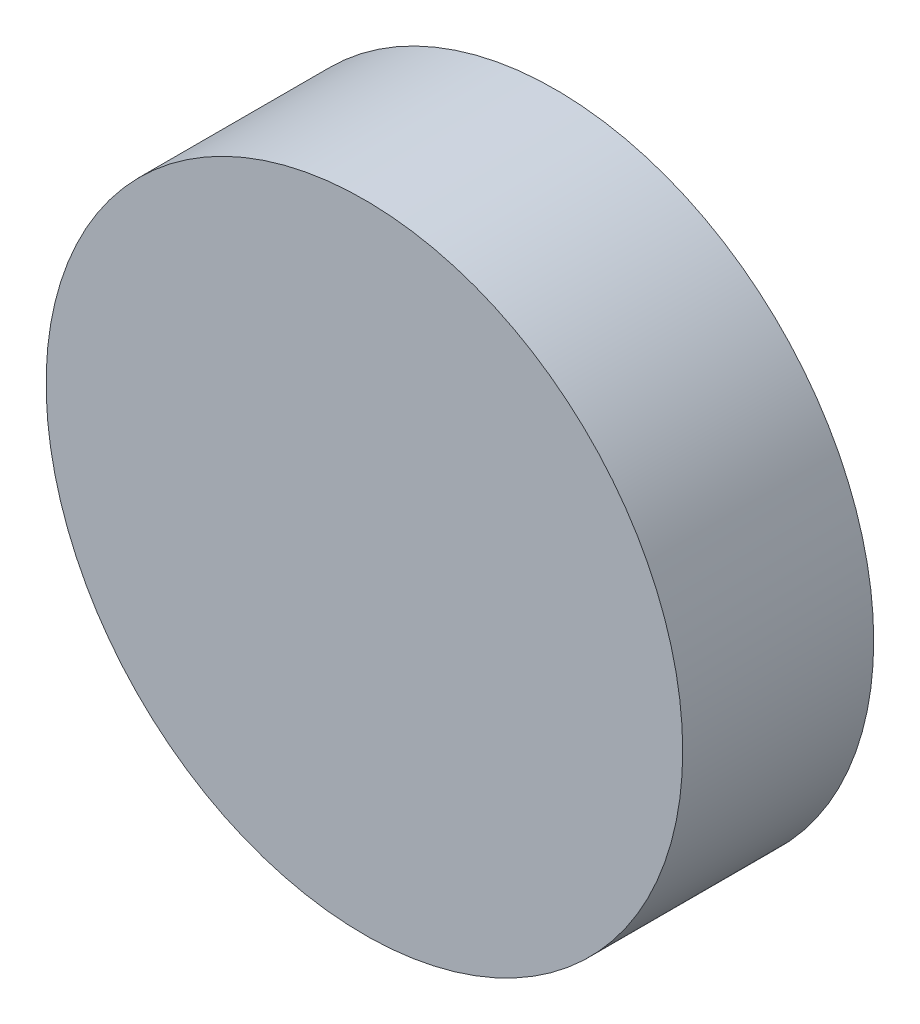
ISO-10303-21;
HEADER;
FILE_DESCRIPTION(('STEP AP214'),'2;1');
FILE_NAME('part.step','',(''),(''),'','','');
FILE_SCHEMA(('AUTOMOTIVE_DESIGN { 1 0 10303 214 1 1 1 1 }'));
ENDSEC;
DATA;
#1=APPLICATION_CONTEXT('core data for automotive mechanical design processes');
#2=APPLICATION_PROTOCOL_DEFINITION('international standard','automotive_design',2000,#1);
#3=PRODUCT_CONTEXT('',#1,'mechanical');
#4=PRODUCT('Part','Part','',(#3));
#5=PRODUCT_RELATED_PRODUCT_CATEGORY('part','',(#4));
#6=PRODUCT_DEFINITION_FORMATION('','',#4);
#7=PRODUCT_DEFINITION_CONTEXT('part definition',#1,'design');
#8=PRODUCT_DEFINITION('design','',#6,#7);
#9=PRODUCT_DEFINITION_SHAPE('','',#8);
#10=(LENGTH_UNIT() NAMED_UNIT(*) SI_UNIT(.MILLI.,.METRE.));
#11=(NAMED_UNIT(*) PLANE_ANGLE_UNIT() SI_UNIT($,.RADIAN.));
#12=(NAMED_UNIT(*) SI_UNIT($,.STERADIAN.) SOLID_ANGLE_UNIT());
#13=UNCERTAINTY_MEASURE_WITH_UNIT(LENGTH_MEASURE(1.E-05),#10,'distance_accuracy_value','');
#14=(GEOMETRIC_REPRESENTATION_CONTEXT(3) GLOBAL_UNCERTAINTY_ASSIGNED_CONTEXT((#13)) GLOBAL_UNIT_ASSIGNED_CONTEXT((#10,
#11,#12)) REPRESENTATION_CONTEXT('',''));
#15=CARTESIAN_POINT('',(0.,0.,0.));
#16=DIRECTION('',(0.,0.,1.));
#17=DIRECTION('',(1.,0.,0.));
#18=AXIS2_PLACEMENT_3D('',#15,#16,#17);
#19=CARTESIAN_POINT('',(26.25,-62.1867148191638,3.));
#20=DIRECTION('',(0.,0.,-1.));
#21=DIRECTION('',(-1.,0.,0.));
#22=AXIS2_PLACEMENT_3D('',#19,#20,#21);
#23=CYLINDRICAL_SURFACE('',#22,5.);
#24=CARTESIAN_POINT('',(26.25,-62.1867148191638,3.));
#25=DIRECTION('',(0.,0.,1.));
#26=DIRECTION('',(1.,0.,0.));
#27=AXIS2_PLACEMENT_3D('',#24,#25,#26);
#28=CIRCLE('',#27,5.);
#29=CARTESIAN_POINT('',(31.25,-62.1867148191638,3.));
#30=VERTEX_POINT('',#29);
#31=EDGE_CURVE('E10',#30,#30,#28,.T.);
#32=ORIENTED_EDGE('',*,*,#31,.F.);
#33=EDGE_LOOP('',(#32));
#34=FACE_BOUND('',#33,.T.);
#35=CARTESIAN_POINT('',(26.25,-62.1867148191638,0.));
#36=DIRECTION('',(0.,0.,1.));
#37=DIRECTION('',(1.,0.,0.));
#38=AXIS2_PLACEMENT_3D('',#35,#36,#37);
#39=CIRCLE('',#38,5.);
#40=CARTESIAN_POINT('',(31.25,-62.1867148191638,0.));
#41=VERTEX_POINT('',#40);
#42=EDGE_CURVE('E38',#41,#41,#39,.T.);
#43=ORIENTED_EDGE('',*,*,#42,.T.);
#44=EDGE_LOOP('',(#43));
#45=FACE_BOUND('',#44,.T.);
#46=ADVANCED_FACE('F35',(#34,#45),#23,.T.);
#47=CARTESIAN_POINT('',(26.25,-62.1867148191638,3.));
#48=DIRECTION('',(0.,0.,1.));
#49=DIRECTION('',(1.,0.,0.));
#50=AXIS2_PLACEMENT_3D('',#47,#48,#49);
#51=PLANE('',#50);
#52=ORIENTED_EDGE('',*,*,#31,.T.);
#53=EDGE_LOOP('',(#52));
#54=FACE_BOUND('',#53,.T.);
#55=ADVANCED_FACE('F50',(#54),#51,.T.);
#56=CARTESIAN_POINT('',(26.25,-62.1867148191638,0.));
#57=DIRECTION('',(0.,0.,1.));
#58=DIRECTION('',(1.,0.,0.));
#59=AXIS2_PLACEMENT_3D('',#56,#57,#58);
#60=PLANE('',#59);
#61=ORIENTED_EDGE('',*,*,#42,.F.);
#62=EDGE_LOOP('',(#61));
#63=FACE_BOUND('',#62,.T.);
#64=ADVANCED_FACE('F48',(#63),#60,.F.);
#65=CLOSED_SHELL('',(#46,#55,#64));
#66=MANIFOLD_SOLID_BREP('B2',#65);
#67=ADVANCED_BREP_SHAPE_REPRESENTATION('',(#18,#66),#14);
#68=SHAPE_DEFINITION_REPRESENTATION(#9,#67);
ENDSEC;
END-ISO-10303-21;
